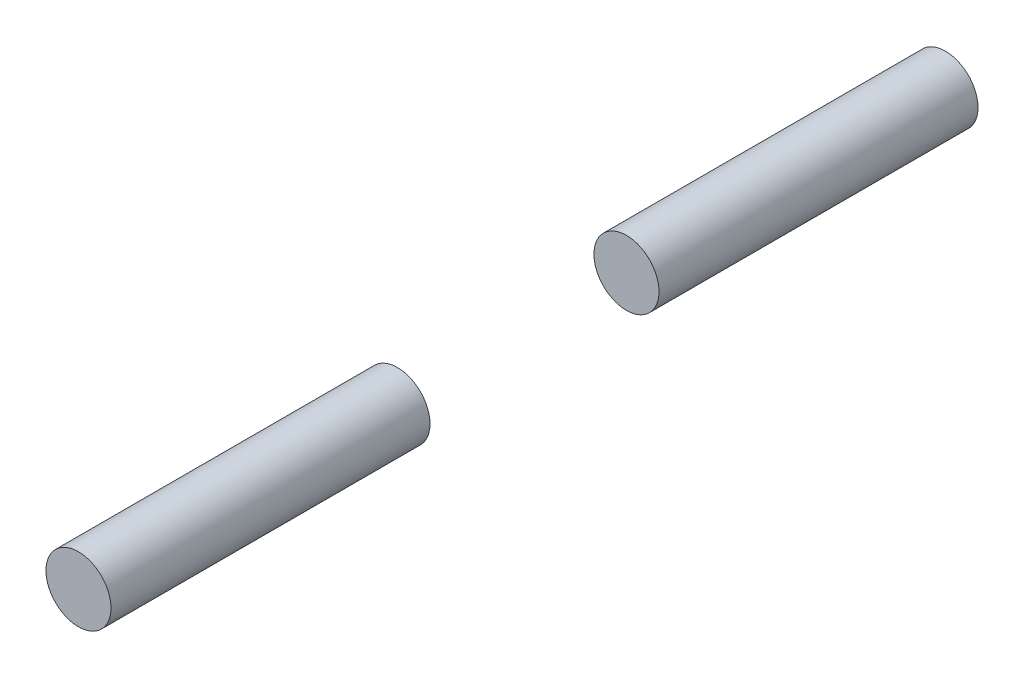
ISO-10303-21;
HEADER;
FILE_DESCRIPTION(('STEP AP214'),'2;1');
FILE_NAME('part.step','',(''),(''),'','','');
FILE_SCHEMA(('AUTOMOTIVE_DESIGN { 1 0 10303 214 1 1 1 1 }'));
ENDSEC;
DATA;
#1=APPLICATION_CONTEXT('core data for automotive mechanical design processes');
#2=APPLICATION_PROTOCOL_DEFINITION('international standard','automotive_design',2000,#1);
#3=PRODUCT_CONTEXT('',#1,'mechanical');
#4=PRODUCT('Part','Part','',(#3));
#5=PRODUCT_RELATED_PRODUCT_CATEGORY('part','',(#4));
#6=PRODUCT_DEFINITION_FORMATION('','',#4);
#7=PRODUCT_DEFINITION_CONTEXT('part definition',#1,'design');
#8=PRODUCT_DEFINITION('design','',#6,#7);
#9=PRODUCT_DEFINITION_SHAPE('','',#8);
#10=(LENGTH_UNIT() NAMED_UNIT(*) SI_UNIT(.MILLI.,.METRE.));
#11=(NAMED_UNIT(*) PLANE_ANGLE_UNIT() SI_UNIT($,.RADIAN.));
#12=(NAMED_UNIT(*) SI_UNIT($,.STERADIAN.) SOLID_ANGLE_UNIT());
#13=UNCERTAINTY_MEASURE_WITH_UNIT(LENGTH_MEASURE(1.E-05),#10,'distance_accuracy_value','');
#14=(GEOMETRIC_REPRESENTATION_CONTEXT(3) GLOBAL_UNCERTAINTY_ASSIGNED_CONTEXT((#13)) GLOBAL_UNIT_ASSIGNED_CONTEXT((#10,
#11,#12)) REPRESENTATION_CONTEXT('',''));
#15=CARTESIAN_POINT('',(0.,0.,0.));
#16=DIRECTION('',(0.,0.,1.));
#17=DIRECTION('',(1.,0.,0.));
#18=AXIS2_PLACEMENT_3D('',#15,#16,#17);
#19=CARTESIAN_POINT('',(0.,0.,-22.86));
#20=DIRECTION('',(0.,0.,-1.));
#21=DIRECTION('',(-1.,0.,0.));
#22=AXIS2_PLACEMENT_3D('',#19,#20,#21);
#23=PLANE('',#22);
#24=CARTESIAN_POINT('',(-36.068,0.,-22.86));
#25=DIRECTION('',(0.,0.,-1.));
#26=DIRECTION('',(-1.,0.,0.));
#27=AXIS2_PLACEMENT_3D('',#24,#25,#26);
#28=CIRCLE('',#27,6.35);
#29=CARTESIAN_POINT('',(-42.418,0.,-22.86));
#30=VERTEX_POINT('',#29);
#31=EDGE_CURVE('E11',#30,#30,#28,.F.);
#32=ORIENTED_EDGE('',*,*,#31,.F.);
#33=EDGE_LOOP('',(#32));
#34=FACE_BOUND('',#33,.T.);
#35=ADVANCED_FACE('F44',(#34),#23,.T.);
#36=CARTESIAN_POINT('',(-36.068,0.,39.4233400000004));
#37=DIRECTION('',(0.,0.,1.));
#38=DIRECTION('',(1.,0.,0.));
#39=AXIS2_PLACEMENT_3D('',#36,#37,#38);
#40=PLANE('',#39);
#41=CARTESIAN_POINT('',(-36.068,0.,39.4233400000004));
#42=DIRECTION('',(0.,0.,1.));
#43=DIRECTION('',(1.,0.,0.));
#44=AXIS2_PLACEMENT_3D('',#41,#42,#43);
#45=CIRCLE('',#44,6.35);
#46=CARTESIAN_POINT('',(-29.718,0.,39.4233400000004));
#47=VERTEX_POINT('',#46);
#48=EDGE_CURVE('E50',#47,#47,#45,.T.);
#49=ORIENTED_EDGE('',*,*,#48,.T.);
#50=EDGE_LOOP('',(#49));
#51=FACE_BOUND('',#50,.T.);
#52=ADVANCED_FACE('F56',(#51),#40,.T.);
#53=CARTESIAN_POINT('',(-36.068,0.,-40.8205122421383));
#54=DIRECTION('',(0.,0.,1.));
#55=DIRECTION('',(1.,0.,0.));
#56=AXIS2_PLACEMENT_3D('',#53,#54,#55);
#57=CYLINDRICAL_SURFACE('',#56,6.35);
#58=ORIENTED_EDGE('',*,*,#48,.F.);
#59=EDGE_LOOP('',(#58));
#60=FACE_BOUND('',#59,.T.);
#61=ORIENTED_EDGE('',*,*,#31,.T.);
#62=EDGE_LOOP('',(#61));
#63=FACE_BOUND('',#62,.T.);
#64=ADVANCED_FACE('F58',(#60,#63),#57,.T.);
#65=CLOSED_SHELL('',(#35,#52,#64));
#66=MANIFOLD_SOLID_BREP('B2',#65);
#67=CARTESIAN_POINT('',(-36.068,1.17961196366423E-13,66.1668277578621));
#68=DIRECTION('',(0.,0.,1.));
#69=DIRECTION('',(1.,0.,0.));
#70=AXIS2_PLACEMENT_3D('',#67,#68,#69);
#71=CYLINDRICAL_SURFACE('',#70,6.35);
#72=CARTESIAN_POINT('',(-36.068,1.17961196366423E-13,84.1273400000004));
#73=DIRECTION('',(0.,0.,1.));
#74=DIRECTION('',(1.,0.,0.));
#75=AXIS2_PLACEMENT_3D('',#72,#73,#74);
#76=CIRCLE('',#75,6.35);
#77=CARTESIAN_POINT('',(-29.718,1.17961196366423E-13,84.1273400000004));
#78=VERTEX_POINT('',#77);
#79=EDGE_CURVE('E43',#78,#78,#76,.F.);
#80=ORIENTED_EDGE('',*,*,#79,.F.);
#81=EDGE_LOOP('',(#80));
#82=FACE_BOUND('',#81,.T.);
#83=CARTESIAN_POINT('',(-36.068,1.17961196366423E-13,146.410680000001));
#84=DIRECTION('',(0.,0.,1.));
#85=DIRECTION('',(1.,0.,0.));
#86=AXIS2_PLACEMENT_3D('',#83,#84,#85);
#87=CIRCLE('',#86,6.35);
#88=CARTESIAN_POINT('',(-29.718,1.17961196366423E-13,146.410680000001));
#89=VERTEX_POINT('',#88);
#90=EDGE_CURVE('E99',#89,#89,#87,.T.);
#91=ORIENTED_EDGE('',*,*,#90,.F.);
#92=EDGE_LOOP('',(#91));
#93=FACE_BOUND('',#92,.T.);
#94=ADVANCED_FACE('F93',(#82,#93),#71,.T.);
#95=CARTESIAN_POINT('',(-36.068,1.17961196366423E-13,146.410680000001));
#96=DIRECTION('',(0.,0.,1.));
#97=DIRECTION('',(1.,0.,0.));
#98=AXIS2_PLACEMENT_3D('',#95,#96,#97);
#99=PLANE('',#98);
#100=ORIENTED_EDGE('',*,*,#90,.T.);
#101=EDGE_LOOP('',(#100));
#102=FACE_BOUND('',#101,.T.);
#103=ADVANCED_FACE('F105',(#102),#99,.T.);
#104=CARTESIAN_POINT('',(0.,0.,84.1273400000004));
#105=DIRECTION('',(0.,0.,1.));
#106=DIRECTION('',(1.,0.,0.));
#107=AXIS2_PLACEMENT_3D('',#104,#105,#106);
#108=PLANE('',#107);
#109=ORIENTED_EDGE('',*,*,#79,.T.);
#110=EDGE_LOOP('',(#109));
#111=FACE_BOUND('',#110,.T.);
#112=ADVANCED_FACE('F112',(#111),#108,.F.);
#113=CLOSED_SHELL('',(#94,#103,#112));
#114=MANIFOLD_SOLID_BREP('B6',#113);
#115=ADVANCED_BREP_SHAPE_REPRESENTATION('',(#18,#66,#114),#14);
#116=SHAPE_DEFINITION_REPRESENTATION(#9,#115);
ENDSEC;
END-ISO-10303-21;
